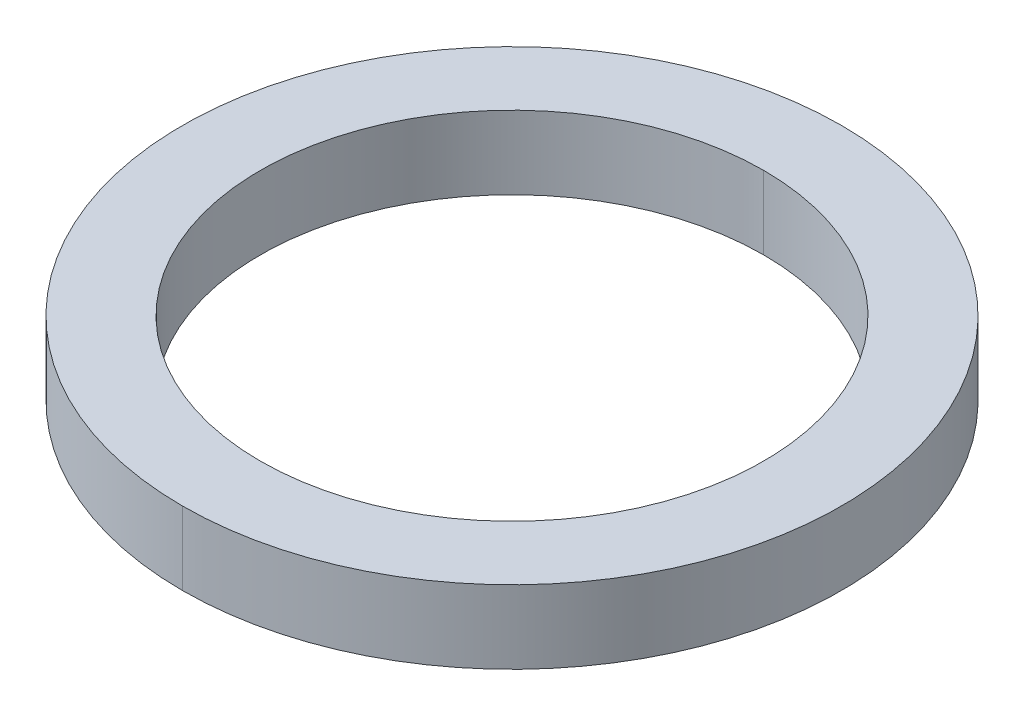
ISO-10303-21;
HEADER;
FILE_DESCRIPTION(('STEP AP214'),'2;1');
FILE_NAME('part.step','',(''),(''),'','','');
FILE_SCHEMA(('AUTOMOTIVE_DESIGN { 1 0 10303 214 1 1 1 1 }'));
ENDSEC;
DATA;
#1=APPLICATION_CONTEXT('core data for automotive mechanical design processes');
#2=APPLICATION_PROTOCOL_DEFINITION('international standard','automotive_design',2000,#1);
#3=PRODUCT_CONTEXT('',#1,'mechanical');
#4=PRODUCT('Part','Part','',(#3));
#5=PRODUCT_RELATED_PRODUCT_CATEGORY('part','',(#4));
#6=PRODUCT_DEFINITION_FORMATION('','',#4);
#7=PRODUCT_DEFINITION_CONTEXT('part definition',#1,'design');
#8=PRODUCT_DEFINITION('design','',#6,#7);
#9=PRODUCT_DEFINITION_SHAPE('','',#8);
#10=(LENGTH_UNIT() NAMED_UNIT(*) SI_UNIT(.MILLI.,.METRE.));
#11=(NAMED_UNIT(*) PLANE_ANGLE_UNIT() SI_UNIT($,.RADIAN.));
#12=(NAMED_UNIT(*) SI_UNIT($,.STERADIAN.) SOLID_ANGLE_UNIT());
#13=UNCERTAINTY_MEASURE_WITH_UNIT(LENGTH_MEASURE(1.E-05),#10,'distance_accuracy_value','');
#14=(GEOMETRIC_REPRESENTATION_CONTEXT(3) GLOBAL_UNCERTAINTY_ASSIGNED_CONTEXT((#13)) GLOBAL_UNIT_ASSIGNED_CONTEXT((#10,
#11,#12)) REPRESENTATION_CONTEXT('',''));
#15=CARTESIAN_POINT('',(0.,0.,0.));
#16=DIRECTION('',(0.,0.,1.));
#17=DIRECTION('',(1.,0.,0.));
#18=AXIS2_PLACEMENT_3D('',#15,#16,#17);
#19=CARTESIAN_POINT('',(0.,8.,0.));
#20=DIRECTION('',(0.,-1.,0.));
#21=DIRECTION('',(0.,0.,-1.));
#22=AXIS2_PLACEMENT_3D('',#19,#20,#21);
#23=CYLINDRICAL_SURFACE('',#22,27.5);
#24=DIRECTION('',(0.,-1.,0.));
#25=VECTOR('',#24,1.);
#26=CARTESIAN_POINT('',(0.,8.,27.5));
#27=LINE('',#26,#25);
#28=CARTESIAN_POINT('',(0.,8.,27.5));
#29=VERTEX_POINT('',#28);
#30=CARTESIAN_POINT('',(0.,0.,27.5));
#31=VERTEX_POINT('',#30);
#32=EDGE_CURVE('E93',#29,#31,#27,.T.);
#33=ORIENTED_EDGE('',*,*,#32,.F.);
#34=CARTESIAN_POINT('',(0.,8.,0.));
#35=DIRECTION('',(0.,1.,0.));
#36=DIRECTION('',(0.,0.,1.));
#37=AXIS2_PLACEMENT_3D('',#34,#35,#36);
#38=CIRCLE('',#37,27.5);
#39=CARTESIAN_POINT('',(0.,8.,-27.5));
#40=VERTEX_POINT('',#39);
#41=EDGE_CURVE('E56',#29,#40,#38,.T.);
#42=ORIENTED_EDGE('',*,*,#41,.T.);
#43=DIRECTION('',(0.,-1.,0.));
#44=VECTOR('',#43,1.);
#45=CARTESIAN_POINT('',(0.,8.,-27.5));
#46=LINE('',#45,#44);
#47=CARTESIAN_POINT('',(0.,0.,-27.5));
#48=VERTEX_POINT('',#47);
#49=EDGE_CURVE('E20',#40,#48,#46,.T.);
#50=ORIENTED_EDGE('',*,*,#49,.T.);
#51=CARTESIAN_POINT('',(0.,0.,0.));
#52=DIRECTION('',(0.,1.,0.));
#53=DIRECTION('',(0.,0.,1.));
#54=AXIS2_PLACEMENT_3D('',#51,#52,#53);
#55=CIRCLE('',#54,27.5);
#56=EDGE_CURVE('E10',#31,#48,#55,.T.);
#57=ORIENTED_EDGE('',*,*,#56,.F.);
#58=EDGE_LOOP('',(#33,#42,#50,#57));
#59=FACE_BOUND('',#58,.T.);
#60=ADVANCED_FACE('F16',(#59),#23,.F.);
#61=CARTESIAN_POINT('',(0.,8.,0.));
#62=DIRECTION('',(0.,-1.,0.));
#63=DIRECTION('',(0.,0.,-1.));
#64=AXIS2_PLACEMENT_3D('',#61,#62,#63);
#65=CYLINDRICAL_SURFACE('',#64,36.);
#66=DIRECTION('',(0.,-1.,0.));
#67=VECTOR('',#66,1.);
#68=CARTESIAN_POINT('',(0.,8.,36.));
#69=LINE('',#68,#67);
#70=CARTESIAN_POINT('',(0.,8.,36.));
#71=VERTEX_POINT('',#70);
#72=CARTESIAN_POINT('',(0.,0.,36.));
#73=VERTEX_POINT('',#72);
#74=EDGE_CURVE('E102',#71,#73,#69,.T.);
#75=ORIENTED_EDGE('',*,*,#74,.F.);
#76=CARTESIAN_POINT('',(0.,8.,0.));
#77=DIRECTION('',(0.,1.,0.));
#78=DIRECTION('',(0.,0.,1.));
#79=AXIS2_PLACEMENT_3D('',#76,#77,#78);
#80=CIRCLE('',#79,36.);
#81=CARTESIAN_POINT('',(0.,8.,-36.));
#82=VERTEX_POINT('',#81);
#83=EDGE_CURVE('E78',#82,#71,#80,.T.);
#84=ORIENTED_EDGE('',*,*,#83,.F.);
#85=DIRECTION('',(0.,-1.,0.));
#86=VECTOR('',#85,1.);
#87=CARTESIAN_POINT('',(0.,8.,-36.));
#88=LINE('',#87,#86);
#89=CARTESIAN_POINT('',(0.,0.,-36.));
#90=VERTEX_POINT('',#89);
#91=EDGE_CURVE('E107',#82,#90,#88,.T.);
#92=ORIENTED_EDGE('',*,*,#91,.T.);
#93=CARTESIAN_POINT('',(0.,0.,0.));
#94=DIRECTION('',(0.,1.,0.));
#95=DIRECTION('',(0.,0.,1.));
#96=AXIS2_PLACEMENT_3D('',#93,#94,#95);
#97=CIRCLE('',#96,36.);
#98=EDGE_CURVE('E27',#90,#73,#97,.T.);
#99=ORIENTED_EDGE('',*,*,#98,.T.);
#100=EDGE_LOOP('',(#75,#84,#92,#99));
#101=FACE_BOUND('',#100,.T.);
#102=ADVANCED_FACE('F128',(#101),#65,.T.);
#103=CARTESIAN_POINT('',(0.,0.,0.));
#104=DIRECTION('',(0.,1.,0.));
#105=DIRECTION('',(1.,0.,0.));
#106=AXIS2_PLACEMENT_3D('',#103,#104,#105);
#107=PLANE('',#106);
#108=CARTESIAN_POINT('',(0.,0.,0.));
#109=DIRECTION('',(0.,1.,0.));
#110=DIRECTION('',(0.,0.,1.));
#111=AXIS2_PLACEMENT_3D('',#108,#109,#110);
#112=CIRCLE('',#111,27.5);
#113=EDGE_CURVE('E87',#48,#31,#112,.T.);
#114=ORIENTED_EDGE('',*,*,#113,.T.);
#115=ORIENTED_EDGE('',*,*,#56,.T.);
#116=EDGE_LOOP('',(#114,#115));
#117=FACE_BOUND('',#116,.T.);
#118=ORIENTED_EDGE('',*,*,#98,.F.);
#119=CARTESIAN_POINT('',(0.,0.,0.));
#120=DIRECTION('',(0.,1.,0.));
#121=DIRECTION('',(0.,0.,1.));
#122=AXIS2_PLACEMENT_3D('',#119,#120,#121);
#123=CIRCLE('',#122,36.);
#124=EDGE_CURVE('E106',#73,#90,#123,.T.);
#125=ORIENTED_EDGE('',*,*,#124,.F.);
#126=EDGE_LOOP('',(#118,#125));
#127=FACE_BOUND('',#126,.T.);
#128=ADVANCED_FACE('F85',(#117,#127),#107,.F.);
#129=CARTESIAN_POINT('',(0.,8.,0.));
#130=DIRECTION('',(0.,1.,0.));
#131=DIRECTION('',(1.,0.,0.));
#132=AXIS2_PLACEMENT_3D('',#129,#130,#131);
#133=PLANE('',#132);
#134=CARTESIAN_POINT('',(0.,8.,0.));
#135=DIRECTION('',(0.,1.,0.));
#136=DIRECTION('',(0.,0.,1.));
#137=AXIS2_PLACEMENT_3D('',#134,#135,#136);
#138=CIRCLE('',#137,27.5);
#139=EDGE_CURVE('E99',#40,#29,#138,.T.);
#140=ORIENTED_EDGE('',*,*,#139,.F.);
#141=ORIENTED_EDGE('',*,*,#41,.F.);
#142=EDGE_LOOP('',(#140,#141));
#143=FACE_BOUND('',#142,.T.);
#144=ORIENTED_EDGE('',*,*,#83,.T.);
#145=CARTESIAN_POINT('',(0.,8.,0.));
#146=DIRECTION('',(0.,1.,0.));
#147=DIRECTION('',(0.,0.,1.));
#148=AXIS2_PLACEMENT_3D('',#145,#146,#147);
#149=CIRCLE('',#148,36.);
#150=EDGE_CURVE('E92',#71,#82,#149,.T.);
#151=ORIENTED_EDGE('',*,*,#150,.T.);
#152=EDGE_LOOP('',(#144,#151));
#153=FACE_BOUND('',#152,.T.);
#154=ADVANCED_FACE('F127',(#143,#153),#133,.T.);
#155=CARTESIAN_POINT('',(0.,8.,0.));
#156=DIRECTION('',(0.,-1.,0.));
#157=DIRECTION('',(0.,0.,-1.));
#158=AXIS2_PLACEMENT_3D('',#155,#156,#157);
#159=CYLINDRICAL_SURFACE('',#158,36.);
#160=ORIENTED_EDGE('',*,*,#150,.F.);
#161=ORIENTED_EDGE('',*,*,#74,.T.);
#162=ORIENTED_EDGE('',*,*,#124,.T.);
#163=ORIENTED_EDGE('',*,*,#91,.F.);
#164=EDGE_LOOP('',(#160,#161,#162,#163));
#165=FACE_BOUND('',#164,.T.);
#166=ADVANCED_FACE('F125',(#165),#159,.T.);
#167=CARTESIAN_POINT('',(0.,8.,0.));
#168=DIRECTION('',(0.,-1.,0.));
#169=DIRECTION('',(0.,0.,-1.));
#170=AXIS2_PLACEMENT_3D('',#167,#168,#169);
#171=CYLINDRICAL_SURFACE('',#170,27.5);
#172=ORIENTED_EDGE('',*,*,#139,.T.);
#173=ORIENTED_EDGE('',*,*,#32,.T.);
#174=ORIENTED_EDGE('',*,*,#113,.F.);
#175=ORIENTED_EDGE('',*,*,#49,.F.);
#176=EDGE_LOOP('',(#172,#173,#174,#175));
#177=FACE_BOUND('',#176,.T.);
#178=ADVANCED_FACE('F18',(#177),#171,.F.);
#179=CLOSED_SHELL('',(#60,#102,#128,#154,#166,#178));
#180=MANIFOLD_SOLID_BREP('B1',#179);
#181=ADVANCED_BREP_SHAPE_REPRESENTATION('',(#18,#180),#14);
#182=SHAPE_DEFINITION_REPRESENTATION(#9,#181);
ENDSEC;
END-ISO-10303-21;
